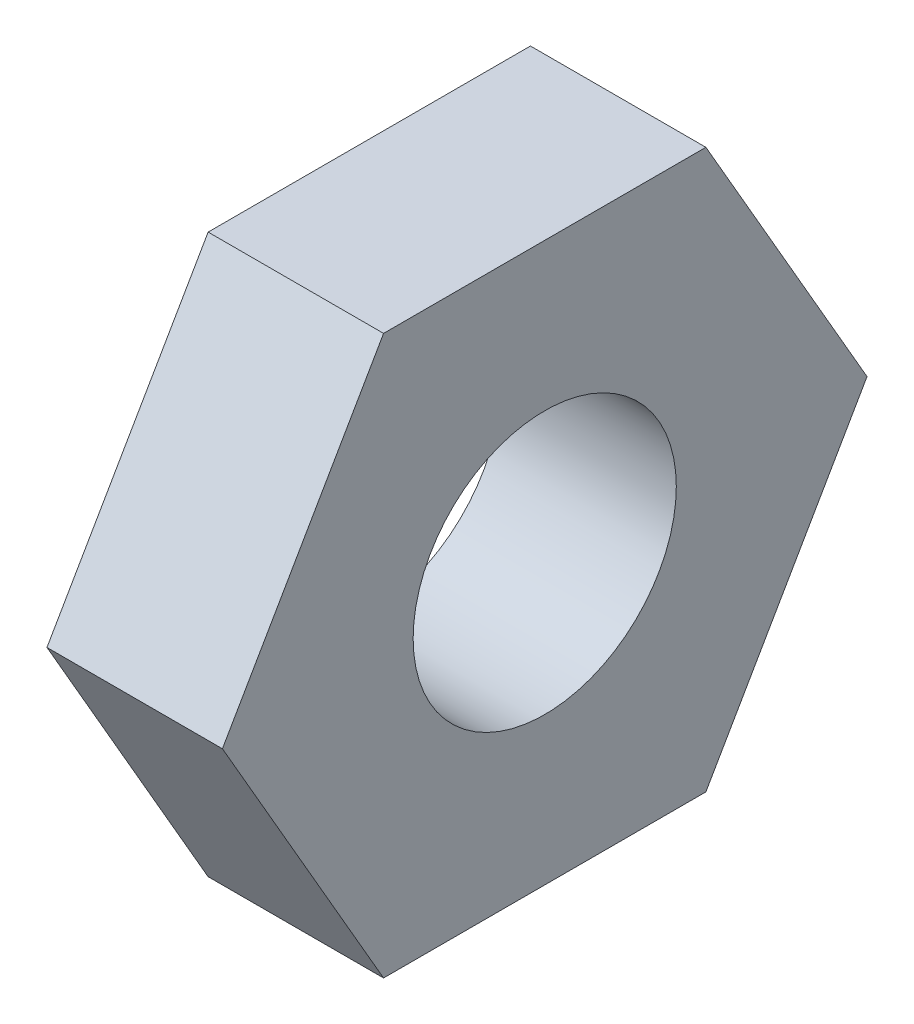
ISO-10303-21;
HEADER;
FILE_DESCRIPTION(('STEP AP214'),'2;1');
FILE_NAME('part.step','',(''),(''),'','','');
FILE_SCHEMA(('AUTOMOTIVE_DESIGN { 1 0 10303 214 1 1 1 1 }'));
ENDSEC;
DATA;
#1=APPLICATION_CONTEXT('core data for automotive mechanical design processes');
#2=APPLICATION_PROTOCOL_DEFINITION('international standard','automotive_design',2000,#1);
#3=PRODUCT_CONTEXT('',#1,'mechanical');
#4=PRODUCT('Part','Part','',(#3));
#5=PRODUCT_RELATED_PRODUCT_CATEGORY('part','',(#4));
#6=PRODUCT_DEFINITION_FORMATION('','',#4);
#7=PRODUCT_DEFINITION_CONTEXT('part definition',#1,'design');
#8=PRODUCT_DEFINITION('design','',#6,#7);
#9=PRODUCT_DEFINITION_SHAPE('','',#8);
#10=(LENGTH_UNIT() NAMED_UNIT(*) SI_UNIT(.MILLI.,.METRE.));
#11=(NAMED_UNIT(*) PLANE_ANGLE_UNIT() SI_UNIT($,.RADIAN.));
#12=(NAMED_UNIT(*) SI_UNIT($,.STERADIAN.) SOLID_ANGLE_UNIT());
#13=UNCERTAINTY_MEASURE_WITH_UNIT(LENGTH_MEASURE(1.E-05),#10,'distance_accuracy_value','');
#14=(GEOMETRIC_REPRESENTATION_CONTEXT(3) GLOBAL_UNCERTAINTY_ASSIGNED_CONTEXT((#13)) GLOBAL_UNIT_ASSIGNED_CONTEXT((#10,
#11,#12)) REPRESENTATION_CONTEXT('',''));
#15=CARTESIAN_POINT('',(0.,0.,0.));
#16=DIRECTION('',(0.,0.,1.));
#17=DIRECTION('',(1.,0.,0.));
#18=AXIS2_PLACEMENT_3D('',#15,#16,#17);
#19=CARTESIAN_POINT('',(2.2,3.5,-2.02072594216369));
#20=DIRECTION('',(1.,0.,0.));
#21=DIRECTION('',(0.,0.,-1.));
#22=AXIS2_PLACEMENT_3D('',#19,#20,#21);
#23=PLANE('',#22);
#24=DIRECTION('',(0.,0.866025403784438,0.5));
#25=VECTOR('',#24,1.);
#26=CARTESIAN_POINT('',(2.2,0.,-4.04145188432738));
#27=LINE('',#26,#25);
#28=CARTESIAN_POINT('',(2.2,0.,-4.04145188432738));
#29=VERTEX_POINT('',#28);
#30=CARTESIAN_POINT('',(2.2,3.5,-2.02072594216369));
#31=VERTEX_POINT('',#30);
#32=EDGE_CURVE('E132',#29,#31,#27,.T.);
#33=ORIENTED_EDGE('',*,*,#32,.T.);
#34=DIRECTION('',(0.,0.,1.));
#35=VECTOR('',#34,1.);
#36=CARTESIAN_POINT('',(2.2,3.5,-2.02072594216369));
#37=LINE('',#36,#35);
#38=CARTESIAN_POINT('',(2.2,3.5,2.02072594216369));
#39=VERTEX_POINT('',#38);
#40=EDGE_CURVE('E90',#31,#39,#37,.T.);
#41=ORIENTED_EDGE('',*,*,#40,.T.);
#42=DIRECTION('',(0.,-0.866025403784439,0.5));
#43=VECTOR('',#42,1.);
#44=CARTESIAN_POINT('',(2.2,3.5,2.02072594216369));
#45=LINE('',#44,#43);
#46=CARTESIAN_POINT('',(2.2,0.,4.04145188432738));
#47=VERTEX_POINT('',#46);
#48=EDGE_CURVE('E103',#39,#47,#45,.T.);
#49=ORIENTED_EDGE('',*,*,#48,.T.);
#50=DIRECTION('',(0.,-0.866025403784438,-0.5));
#51=VECTOR('',#50,1.);
#52=CARTESIAN_POINT('',(2.2,0.,4.04145188432738));
#53=LINE('',#52,#51);
#54=CARTESIAN_POINT('',(2.2,-3.5,2.02072594216369));
#55=VERTEX_POINT('',#54);
#56=EDGE_CURVE('E97',#47,#55,#53,.T.);
#57=ORIENTED_EDGE('',*,*,#56,.T.);
#58=DIRECTION('',(0.,0.,-1.));
#59=VECTOR('',#58,1.);
#60=CARTESIAN_POINT('',(2.2,-3.5,2.02072594216369));
#61=LINE('',#60,#59);
#62=CARTESIAN_POINT('',(2.2,-3.5,-2.02072594216369));
#63=VERTEX_POINT('',#62);
#64=EDGE_CURVE('E101',#55,#63,#61,.T.);
#65=ORIENTED_EDGE('',*,*,#64,.T.);
#66=DIRECTION('',(0.,0.866025403784439,-0.5));
#67=VECTOR('',#66,1.);
#68=CARTESIAN_POINT('',(2.2,-3.5,-2.02072594216369));
#69=LINE('',#68,#67);
#70=EDGE_CURVE('E53',#63,#29,#69,.T.);
#71=ORIENTED_EDGE('',*,*,#70,.T.);
#72=EDGE_LOOP('',(#33,#41,#49,#57,#65,#71));
#73=FACE_BOUND('',#72,.T.);
#74=CARTESIAN_POINT('',(2.2,0.,0.));
#75=DIRECTION('',(1.,0.,0.));
#76=DIRECTION('',(0.,0.,-1.));
#77=AXIS2_PLACEMENT_3D('',#74,#75,#76);
#78=CIRCLE('',#77,1.65);
#79=CARTESIAN_POINT('',(2.2,0.,-1.65));
#80=VERTEX_POINT('',#79);
#81=EDGE_CURVE('E125',#80,#80,#78,.T.);
#82=ORIENTED_EDGE('',*,*,#81,.F.);
#83=EDGE_LOOP('',(#82));
#84=FACE_BOUND('',#83,.T.);
#85=ADVANCED_FACE('F36',(#73,#84),#23,.T.);
#86=CARTESIAN_POINT('',(0.,3.5,-2.02072594216369));
#87=DIRECTION('',(1.,0.,0.));
#88=DIRECTION('',(0.,0.,-1.));
#89=AXIS2_PLACEMENT_3D('',#86,#87,#88);
#90=PLANE('',#89);
#91=DIRECTION('',(0.,0.866025403784438,0.5));
#92=VECTOR('',#91,1.);
#93=CARTESIAN_POINT('',(0.,0.,-4.04145188432738));
#94=LINE('',#93,#92);
#95=CARTESIAN_POINT('',(0.,0.,-4.04145188432738));
#96=VERTEX_POINT('',#95);
#97=CARTESIAN_POINT('',(0.,3.5,-2.02072594216369));
#98=VERTEX_POINT('',#97);
#99=EDGE_CURVE('E121',#96,#98,#94,.T.);
#100=ORIENTED_EDGE('',*,*,#99,.F.);
#101=DIRECTION('',(0.,0.866025403784439,-0.5));
#102=VECTOR('',#101,1.);
#103=CARTESIAN_POINT('',(0.,-3.5,-2.02072594216369));
#104=LINE('',#103,#102);
#105=CARTESIAN_POINT('',(0.,-3.5,-2.02072594216369));
#106=VERTEX_POINT('',#105);
#107=EDGE_CURVE('E82',#106,#96,#104,.T.);
#108=ORIENTED_EDGE('',*,*,#107,.F.);
#109=DIRECTION('',(0.,0.,-1.));
#110=VECTOR('',#109,1.);
#111=CARTESIAN_POINT('',(0.,-3.5,2.02072594216369));
#112=LINE('',#111,#110);
#113=CARTESIAN_POINT('',(0.,-3.5,2.02072594216369));
#114=VERTEX_POINT('',#113);
#115=EDGE_CURVE('E76',#114,#106,#112,.T.);
#116=ORIENTED_EDGE('',*,*,#115,.F.);
#117=DIRECTION('',(0.,-0.866025403784438,-0.5));
#118=VECTOR('',#117,1.);
#119=CARTESIAN_POINT('',(0.,0.,4.04145188432738));
#120=LINE('',#119,#118);
#121=CARTESIAN_POINT('',(0.,0.,4.04145188432738));
#122=VERTEX_POINT('',#121);
#123=EDGE_CURVE('E111',#122,#114,#120,.T.);
#124=ORIENTED_EDGE('',*,*,#123,.F.);
#125=DIRECTION('',(0.,-0.866025403784439,0.5));
#126=VECTOR('',#125,1.);
#127=CARTESIAN_POINT('',(0.,3.5,2.02072594216369));
#128=LINE('',#127,#126);
#129=CARTESIAN_POINT('',(0.,3.5,2.02072594216369));
#130=VERTEX_POINT('',#129);
#131=EDGE_CURVE('E127',#130,#122,#128,.T.);
#132=ORIENTED_EDGE('',*,*,#131,.F.);
#133=DIRECTION('',(0.,0.,1.));
#134=VECTOR('',#133,1.);
#135=CARTESIAN_POINT('',(0.,3.5,-2.02072594216369));
#136=LINE('',#135,#134);
#137=EDGE_CURVE('E124',#98,#130,#136,.T.);
#138=ORIENTED_EDGE('',*,*,#137,.F.);
#139=EDGE_LOOP('',(#100,#108,#116,#124,#132,#138));
#140=FACE_BOUND('',#139,.T.);
#141=CARTESIAN_POINT('',(0.,0.,0.));
#142=DIRECTION('',(1.,0.,0.));
#143=DIRECTION('',(0.,0.,-1.));
#144=AXIS2_PLACEMENT_3D('',#141,#142,#143);
#145=CIRCLE('',#144,1.65);
#146=CARTESIAN_POINT('',(0.,0.,-1.65));
#147=VERTEX_POINT('',#146);
#148=EDGE_CURVE('E227',#147,#147,#145,.T.);
#149=ORIENTED_EDGE('',*,*,#148,.T.);
#150=EDGE_LOOP('',(#149));
#151=FACE_BOUND('',#150,.T.);
#152=ADVANCED_FACE('F141',(#140,#151),#90,.F.);
#153=CARTESIAN_POINT('',(2.2,0.,-4.04145188432738));
#154=DIRECTION('',(0.,-0.5,0.866025403784438));
#155=DIRECTION('',(0.,-0.866025403784439,-0.5));
#156=AXIS2_PLACEMENT_3D('',#153,#154,#155);
#157=PLANE('',#156);
#158=ORIENTED_EDGE('',*,*,#99,.T.);
#159=DIRECTION('',(-1.,0.,0.));
#160=VECTOR('',#159,1.);
#161=CARTESIAN_POINT('',(2.2,3.5,-2.02072594216369));
#162=LINE('',#161,#160);
#163=EDGE_CURVE('E11',#31,#98,#162,.T.);
#164=ORIENTED_EDGE('',*,*,#163,.F.);
#165=ORIENTED_EDGE('',*,*,#32,.F.);
#166=DIRECTION('',(-1.,0.,0.));
#167=VECTOR('',#166,1.);
#168=CARTESIAN_POINT('',(2.2,0.,-4.04145188432738));
#169=LINE('',#168,#167);
#170=EDGE_CURVE('E117',#29,#96,#169,.T.);
#171=ORIENTED_EDGE('',*,*,#170,.T.);
#172=EDGE_LOOP('',(#158,#164,#165,#171));
#173=FACE_BOUND('',#172,.T.);
#174=ADVANCED_FACE('F38',(#173),#157,.F.);
#175=CARTESIAN_POINT('',(2.2,3.5,-2.02072594216369));
#176=DIRECTION('',(0.,-1.,0.));
#177=DIRECTION('',(0.,0.,-1.));
#178=AXIS2_PLACEMENT_3D('',#175,#176,#177);
#179=PLANE('',#178);
#180=ORIENTED_EDGE('',*,*,#137,.T.);
#181=DIRECTION('',(-1.,0.,0.));
#182=VECTOR('',#181,1.);
#183=CARTESIAN_POINT('',(2.2,3.5,2.02072594216369));
#184=LINE('',#183,#182);
#185=EDGE_CURVE('E45',#39,#130,#184,.T.);
#186=ORIENTED_EDGE('',*,*,#185,.F.);
#187=ORIENTED_EDGE('',*,*,#40,.F.);
#188=ORIENTED_EDGE('',*,*,#163,.T.);
#189=EDGE_LOOP('',(#180,#186,#187,#188));
#190=FACE_BOUND('',#189,.T.);
#191=ADVANCED_FACE('F166',(#190),#179,.F.);
#192=CARTESIAN_POINT('',(2.2,3.5,2.02072594216369));
#193=DIRECTION('',(0.,-0.5,-0.866025403784439));
#194=DIRECTION('',(0.,0.866025403784439,-0.5));
#195=AXIS2_PLACEMENT_3D('',#192,#193,#194);
#196=PLANE('',#195);
#197=ORIENTED_EDGE('',*,*,#131,.T.);
#198=DIRECTION('',(-1.,0.,0.));
#199=VECTOR('',#198,1.);
#200=CARTESIAN_POINT('',(2.2,0.,4.04145188432738));
#201=LINE('',#200,#199);
#202=EDGE_CURVE('E112',#47,#122,#201,.T.);
#203=ORIENTED_EDGE('',*,*,#202,.F.);
#204=ORIENTED_EDGE('',*,*,#48,.F.);
#205=ORIENTED_EDGE('',*,*,#185,.T.);
#206=EDGE_LOOP('',(#197,#203,#204,#205));
#207=FACE_BOUND('',#206,.T.);
#208=ADVANCED_FACE('F138',(#207),#196,.F.);
#209=CARTESIAN_POINT('',(2.2,0.,4.04145188432738));
#210=DIRECTION('',(0.,0.5,-0.866025403784438));
#211=DIRECTION('',(0.,0.866025403784438,0.5));
#212=AXIS2_PLACEMENT_3D('',#209,#210,#211);
#213=PLANE('',#212);
#214=ORIENTED_EDGE('',*,*,#123,.T.);
#215=DIRECTION('',(-1.,0.,0.));
#216=VECTOR('',#215,1.);
#217=CARTESIAN_POINT('',(2.2,-3.5,2.02072594216369));
#218=LINE('',#217,#216);
#219=EDGE_CURVE('E108',#55,#114,#218,.T.);
#220=ORIENTED_EDGE('',*,*,#219,.F.);
#221=ORIENTED_EDGE('',*,*,#56,.F.);
#222=ORIENTED_EDGE('',*,*,#202,.T.);
#223=EDGE_LOOP('',(#214,#220,#221,#222));
#224=FACE_BOUND('',#223,.T.);
#225=ADVANCED_FACE('F109',(#224),#213,.F.);
#226=CARTESIAN_POINT('',(2.2,-3.5,2.02072594216369));
#227=DIRECTION('',(0.,1.,0.));
#228=DIRECTION('',(0.,0.,1.));
#229=AXIS2_PLACEMENT_3D('',#226,#227,#228);
#230=PLANE('',#229);
#231=ORIENTED_EDGE('',*,*,#115,.T.);
#232=DIRECTION('',(-1.,0.,0.));
#233=VECTOR('',#232,1.);
#234=CARTESIAN_POINT('',(2.2,-3.5,-2.02072594216369));
#235=LINE('',#234,#233);
#236=EDGE_CURVE('E113',#63,#106,#235,.T.);
#237=ORIENTED_EDGE('',*,*,#236,.F.);
#238=ORIENTED_EDGE('',*,*,#64,.F.);
#239=ORIENTED_EDGE('',*,*,#219,.T.);
#240=EDGE_LOOP('',(#231,#237,#238,#239));
#241=FACE_BOUND('',#240,.T.);
#242=ADVANCED_FACE('F115',(#241),#230,.F.);
#243=CARTESIAN_POINT('',(2.2,-3.5,-2.02072594216369));
#244=DIRECTION('',(0.,0.5,0.866025403784439));
#245=DIRECTION('',(0.,-0.866025403784439,0.5));
#246=AXIS2_PLACEMENT_3D('',#243,#244,#245);
#247=PLANE('',#246);
#248=ORIENTED_EDGE('',*,*,#107,.T.);
#249=ORIENTED_EDGE('',*,*,#170,.F.);
#250=ORIENTED_EDGE('',*,*,#70,.F.);
#251=ORIENTED_EDGE('',*,*,#236,.T.);
#252=EDGE_LOOP('',(#248,#249,#250,#251));
#253=FACE_BOUND('',#252,.T.);
#254=ADVANCED_FACE('F146',(#253),#247,.F.);
#255=CARTESIAN_POINT('',(2.2,0.,0.));
#256=DIRECTION('',(-1.,0.,0.));
#257=DIRECTION('',(0.,0.,1.));
#258=AXIS2_PLACEMENT_3D('',#255,#256,#257);
#259=CYLINDRICAL_SURFACE('',#258,1.65);
#260=ORIENTED_EDGE('',*,*,#81,.T.);
#261=EDGE_LOOP('',(#260));
#262=FACE_BOUND('',#261,.T.);
#263=ORIENTED_EDGE('',*,*,#148,.F.);
#264=EDGE_LOOP('',(#263));
#265=FACE_BOUND('',#264,.T.);
#266=ADVANCED_FACE('F148',(#262,#265),#259,.F.);
#267=CLOSED_SHELL('',(#85,#152,#174,#191,#208,#225,#242,#254,#266));
#268=MANIFOLD_SOLID_BREP('B2',#267);
#269=ADVANCED_BREP_SHAPE_REPRESENTATION('',(#18,#268),#14);
#270=SHAPE_DEFINITION_REPRESENTATION(#9,#269);
ENDSEC;
END-ISO-10303-21;
